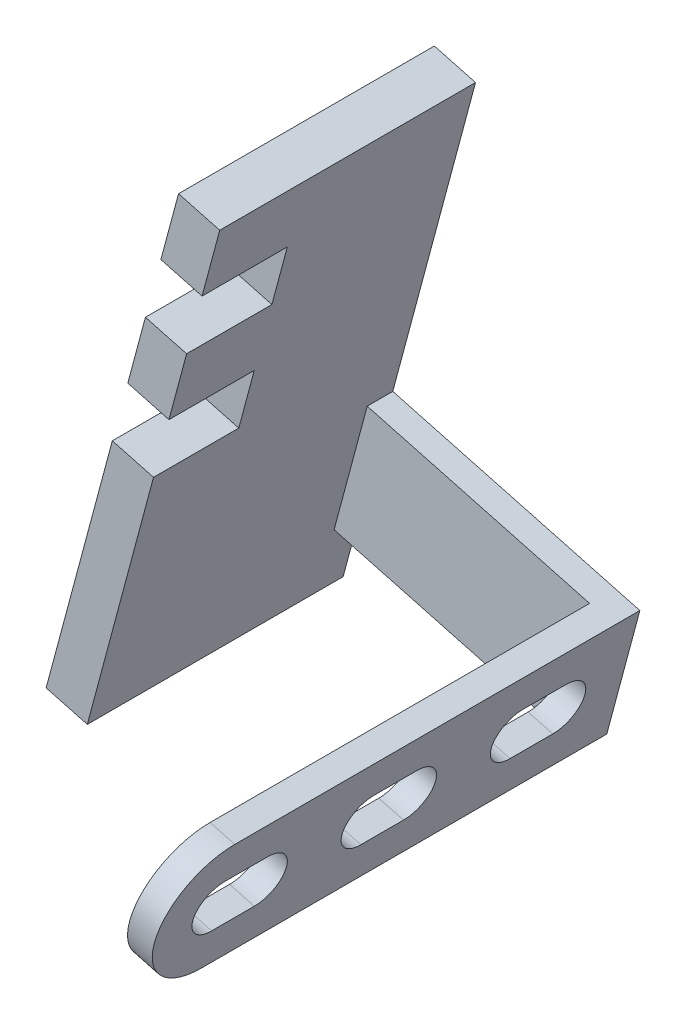
ISO-10303-21;
HEADER;
FILE_DESCRIPTION(('STEP AP214'),'2;1');
FILE_NAME('part.step','',(''),(''),'','','');
FILE_SCHEMA(('AUTOMOTIVE_DESIGN { 1 0 10303 214 1 1 1 1 }'));
ENDSEC;
DATA;
#1=APPLICATION_CONTEXT('core data for automotive mechanical design processes');
#2=APPLICATION_PROTOCOL_DEFINITION('international standard','automotive_design',2000,#1);
#3=PRODUCT_CONTEXT('',#1,'mechanical');
#4=PRODUCT('Part','Part','',(#3));
#5=PRODUCT_RELATED_PRODUCT_CATEGORY('part','',(#4));
#6=PRODUCT_DEFINITION_FORMATION('','',#4);
#7=PRODUCT_DEFINITION_CONTEXT('part definition',#1,'design');
#8=PRODUCT_DEFINITION('design','',#6,#7);
#9=PRODUCT_DEFINITION_SHAPE('','',#8);
#10=(LENGTH_UNIT() NAMED_UNIT(*) SI_UNIT(.MILLI.,.METRE.));
#11=(NAMED_UNIT(*) PLANE_ANGLE_UNIT() SI_UNIT($,.RADIAN.));
#12=(NAMED_UNIT(*) SI_UNIT($,.STERADIAN.) SOLID_ANGLE_UNIT());
#13=UNCERTAINTY_MEASURE_WITH_UNIT(LENGTH_MEASURE(1.E-05),#10,'distance_accuracy_value','');
#14=(GEOMETRIC_REPRESENTATION_CONTEXT(3) GLOBAL_UNCERTAINTY_ASSIGNED_CONTEXT((#13)) GLOBAL_UNIT_ASSIGNED_CONTEXT((#10,
#11,#12)) REPRESENTATION_CONTEXT('',''));
#15=CARTESIAN_POINT('',(0.,0.,0.));
#16=DIRECTION('',(0.,0.,1.));
#17=DIRECTION('',(1.,0.,0.));
#18=AXIS2_PLACEMENT_3D('',#15,#16,#17);
#19=CARTESIAN_POINT('',(0.,0.,30.));
#20=DIRECTION('',(-0.965925826289069,0.258819045102518,0.));
#21=DIRECTION('',(-0.258819045102518,-0.965925826289069,0.));
#22=AXIS2_PLACEMENT_3D('',#19,#20,#21);
#23=PLANE('',#22);
#24=DIRECTION('',(0.,0.,-1.));
#25=VECTOR('',#24,1.);
#26=CARTESIAN_POINT('',(3.88228567653777,14.488887394336,-30.));
#27=LINE('',#26,#25);
#28=CARTESIAN_POINT('',(3.88228567653776,14.488887394336,-24.));
#29=VERTEX_POINT('',#28);
#30=CARTESIAN_POINT('',(3.88228567653777,14.488887394336,-30.));
#31=VERTEX_POINT('',#30);
#32=EDGE_CURVE('E345',#29,#31,#27,.T.);
#33=ORIENTED_EDGE('',*,*,#32,.F.);
#34=DIRECTION('',(0.258819045102517,0.965925826289069,0.));
#35=VECTOR('',#34,1.);
#36=CARTESIAN_POINT('',(3.88228567653776,14.488887394336,-24.));
#37=LINE('',#36,#35);
#38=CARTESIAN_POINT('',(11.6468570296133,43.4666621830081,-24.));
#39=VERTEX_POINT('',#38);
#40=EDGE_CURVE('E366',#29,#39,#37,.T.);
#41=ORIENTED_EDGE('',*,*,#40,.T.);
#42=DIRECTION('',(0.,0.,-1.));
#43=VECTOR('',#42,1.);
#44=CARTESIAN_POINT('',(11.6468570296133,43.4666621830081,-30.));
#45=LINE('',#44,#43);
#46=CARTESIAN_POINT('',(11.6468570296133,43.4666621830081,-30.));
#47=VERTEX_POINT('',#46);
#48=EDGE_CURVE('E341',#39,#47,#45,.T.);
#49=ORIENTED_EDGE('',*,*,#48,.T.);
#50=DIRECTION('',(0.258819045102518,0.965925826289069,0.));
#51=VECTOR('',#50,1.);
#52=CARTESIAN_POINT('',(0.,0.,-30.));
#53=LINE('',#52,#51);
#54=CARTESIAN_POINT('',(31.0582854123021,115.911099154688,-30.));
#55=VERTEX_POINT('',#54);
#56=EDGE_CURVE('E442',#47,#55,#53,.T.);
#57=ORIENTED_EDGE('',*,*,#56,.T.);
#58=DIRECTION('',(0.,0.,-1.));
#59=VECTOR('',#58,1.);
#60=CARTESIAN_POINT('',(31.0582854123021,115.911099154688,30.));
#61=LINE('',#60,#59);
#62=CARTESIAN_POINT('',(31.0582854123021,115.911099154688,30.));
#63=VERTEX_POINT('',#62);
#64=EDGE_CURVE('E486',#63,#55,#61,.T.);
#65=ORIENTED_EDGE('',*,*,#64,.F.);
#66=DIRECTION('',(0.258819045102518,0.965925826289069,0.));
#67=VECTOR('',#66,1.);
#68=CARTESIAN_POINT('',(0.,0.,30.));
#69=LINE('',#68,#67);
#70=CARTESIAN_POINT('',(26.9171806906619,100.456285934063,30.));
#71=VERTEX_POINT('',#70);
#72=EDGE_CURVE('E449',#71,#63,#69,.T.);
#73=ORIENTED_EDGE('',*,*,#72,.F.);
#74=DIRECTION('',(0.,0.,1.));
#75=VECTOR('',#74,1.);
#76=CARTESIAN_POINT('',(26.9171806906619,100.456285934063,30.));
#77=LINE('',#76,#75);
#78=CARTESIAN_POINT('',(26.9171806906619,100.456285934063,10.));
#79=VERTEX_POINT('',#78);
#80=EDGE_CURVE('E421',#79,#71,#77,.T.);
#81=ORIENTED_EDGE('',*,*,#80,.F.);
#82=DIRECTION('',(0.258819045102518,0.965925826289069,0.));
#83=VECTOR('',#82,1.);
#84=CARTESIAN_POINT('',(26.9171806906619,100.456285934063,10.));
#85=LINE('',#84,#83);
#86=CARTESIAN_POINT('',(23.2937140592266,86.9333243660162,9.99999999999999));
#87=VERTEX_POINT('',#86);
#88=EDGE_CURVE('E417',#87,#79,#85,.T.);
#89=ORIENTED_EDGE('',*,*,#88,.F.);
#90=DIRECTION('',(0.,0.,-1.));
#91=VECTOR('',#90,1.);
#92=CARTESIAN_POINT('',(23.2937140592266,86.9333243660162,30.));
#93=LINE('',#92,#91);
#94=CARTESIAN_POINT('',(23.2937140592266,86.9333243660162,30.));
#95=VERTEX_POINT('',#94);
#96=EDGE_CURVE('E413',#95,#87,#93,.T.);
#97=ORIENTED_EDGE('',*,*,#96,.F.);
#98=CARTESIAN_POINT('',(19.1526093375863,71.4785111453911,30.));
#99=VERTEX_POINT('',#98);
#100=EDGE_CURVE('E448',#99,#95,#69,.T.);
#101=ORIENTED_EDGE('',*,*,#100,.F.);
#102=DIRECTION('',(0.,0.,1.));
#103=VECTOR('',#102,1.);
#104=CARTESIAN_POINT('',(19.1526093375863,71.4785111453911,30.));
#105=LINE('',#104,#103);
#106=CARTESIAN_POINT('',(19.1526093375863,71.4785111453911,9.99999999999999));
#107=VERTEX_POINT('',#106);
#108=EDGE_CURVE('E400',#107,#99,#105,.T.);
#109=ORIENTED_EDGE('',*,*,#108,.F.);
#110=DIRECTION('',(0.258819045102518,0.965925826289069,0.));
#111=VECTOR('',#110,1.);
#112=CARTESIAN_POINT('',(19.1526093375863,71.4785111453911,9.99999999999999));
#113=LINE('',#112,#111);
#114=CARTESIAN_POINT('',(15.5291427061511,57.9555495773442,9.99999999999999));
#115=VERTEX_POINT('',#114);
#116=EDGE_CURVE('E405',#115,#107,#113,.T.);
#117=ORIENTED_EDGE('',*,*,#116,.F.);
#118=DIRECTION('',(0.,0.,-1.));
#119=VECTOR('',#118,1.);
#120=CARTESIAN_POINT('',(15.5291427061511,57.9555495773442,30.));
#121=LINE('',#120,#119);
#122=CARTESIAN_POINT('',(15.5291427061511,57.9555495773442,30.));
#123=VERTEX_POINT('',#122);
#124=EDGE_CURVE('E409',#123,#115,#121,.T.);
#125=ORIENTED_EDGE('',*,*,#124,.F.);
#126=CARTESIAN_POINT('',(0.,0.,30.));
#127=VERTEX_POINT('',#126);
#128=EDGE_CURVE('E443',#127,#123,#69,.T.);
#129=ORIENTED_EDGE('',*,*,#128,.F.);
#130=DIRECTION('',(0.,0.,-1.));
#131=VECTOR('',#130,1.);
#132=CARTESIAN_POINT('',(0.,0.,30.));
#133=LINE('',#132,#131);
#134=CARTESIAN_POINT('',(0.,0.,-30.));
#135=VERTEX_POINT('',#134);
#136=EDGE_CURVE('E462',#127,#135,#133,.T.);
#137=ORIENTED_EDGE('',*,*,#136,.T.);
#138=EDGE_CURVE('E463',#135,#31,#53,.T.);
#139=ORIENTED_EDGE('',*,*,#138,.T.);
#140=EDGE_LOOP('',(#33,#41,#49,#57,#65,#73,#81,#89,#97,#101,#109,#117,#125,#129,#137,#139));
#141=FACE_BOUND('',#140,.T.);
#142=ADVANCED_FACE('F45',(#141),#23,.F.);
#143=CARTESIAN_POINT('',(0.,0.,30.));
#144=DIRECTION('',(0.,0.,-1.));
#145=DIRECTION('',(-1.,0.,0.));
#146=AXIS2_PLACEMENT_3D('',#143,#144,#145);
#147=PLANE('',#146);
#148=DIRECTION('',(0.258819045102518,0.965925826289069,0.));
#149=VECTOR('',#148,1.);
#150=CARTESIAN_POINT('',(-9.65925826289068,2.58819045102517,30.));
#151=LINE('',#150,#149);
#152=CARTESIAN_POINT('',(9.4933510746956,74.0667015964163,30.));
#153=VERTEX_POINT('',#152);
#154=CARTESIAN_POINT('',(13.6344557963359,89.5215148170414,30.));
#155=VERTEX_POINT('',#154);
#156=EDGE_CURVE('E459',#153,#155,#151,.T.);
#157=ORIENTED_EDGE('',*,*,#156,.F.);
#158=DIRECTION('',(0.965925826289069,-0.258819045102518,0.));
#159=VECTOR('',#158,1.);
#160=CARTESIAN_POINT('',(19.1526093375863,71.4785111453911,30.));
#161=LINE('',#160,#159);
#162=EDGE_CURVE('E502',#153,#99,#161,.T.);
#163=ORIENTED_EDGE('',*,*,#162,.T.);
#164=ORIENTED_EDGE('',*,*,#100,.T.);
#165=DIRECTION('',(-0.965925826289069,0.258819045102518,0.));
#166=VECTOR('',#165,1.);
#167=CARTESIAN_POINT('',(23.2937140592266,86.9333243660162,30.));
#168=LINE('',#167,#166);
#169=EDGE_CURVE('E490',#95,#155,#168,.T.);
#170=ORIENTED_EDGE('',*,*,#169,.T.);
#171=EDGE_LOOP('',(#157,#163,#164,#170));
#172=FACE_BOUND('',#171,.T.);
#173=ADVANCED_FACE('F571',(#172),#147,.F.);
#174=CARTESIAN_POINT('',(17.2579224277711,103.044476385088,30.));
#175=VERTEX_POINT('',#174);
#176=CARTESIAN_POINT('',(21.3990271494114,118.499289605713,30.));
#177=VERTEX_POINT('',#176);
#178=EDGE_CURVE('E453',#175,#177,#151,.T.);
#179=ORIENTED_EDGE('',*,*,#178,.F.);
#180=DIRECTION('',(0.965925826289069,-0.258819045102518,0.));
#181=VECTOR('',#180,1.);
#182=CARTESIAN_POINT('',(26.9171806906619,100.456285934063,30.));
#183=LINE('',#182,#181);
#184=EDGE_CURVE('E494',#175,#71,#183,.T.);
#185=ORIENTED_EDGE('',*,*,#184,.T.);
#186=ORIENTED_EDGE('',*,*,#72,.T.);
#187=DIRECTION('',(0.965925826289069,-0.258819045102517,0.));
#188=VECTOR('',#187,1.);
#189=CARTESIAN_POINT('',(21.3990271494114,118.499289605713,30.));
#190=LINE('',#189,#188);
#191=EDGE_CURVE('E447',#177,#63,#190,.T.);
#192=ORIENTED_EDGE('',*,*,#191,.F.);
#193=EDGE_LOOP('',(#179,#185,#186,#192));
#194=FACE_BOUND('',#193,.T.);
#195=ADVANCED_FACE('F578',(#194),#147,.F.);
#196=CARTESIAN_POINT('',(21.3990271494114,118.499289605713,30.));
#197=DIRECTION('',(0.258819045102517,0.965925826289069,0.));
#198=DIRECTION('',(-0.965925826289069,0.258819045102517,0.));
#199=AXIS2_PLACEMENT_3D('',#196,#197,#198);
#200=PLANE('',#199);
#201=DIRECTION('',(0.965925826289069,-0.258819045102517,0.));
#202=VECTOR('',#201,1.);
#203=CARTESIAN_POINT('',(21.3990271494114,118.499289605713,-30.));
#204=LINE('',#203,#202);
#205=CARTESIAN_POINT('',(21.3990271494114,118.499289605713,-30.));
#206=VERTEX_POINT('',#205);
#207=EDGE_CURVE('E466',#206,#55,#204,.T.);
#208=ORIENTED_EDGE('',*,*,#207,.F.);
#209=DIRECTION('',(0.,0.,-1.));
#210=VECTOR('',#209,1.);
#211=CARTESIAN_POINT('',(21.3990271494114,118.499289605713,30.));
#212=LINE('',#211,#210);
#213=EDGE_CURVE('E483',#177,#206,#212,.T.);
#214=ORIENTED_EDGE('',*,*,#213,.F.);
#215=ORIENTED_EDGE('',*,*,#191,.T.);
#216=ORIENTED_EDGE('',*,*,#64,.T.);
#217=EDGE_LOOP('',(#208,#214,#215,#216));
#218=FACE_BOUND('',#217,.T.);
#219=ADVANCED_FACE('F604',(#218),#200,.T.);
#220=CARTESIAN_POINT('',(-9.65925826289068,2.58819045102517,30.));
#221=DIRECTION('',(-0.965925826289069,0.258819045102518,0.));
#222=DIRECTION('',(-0.258819045102518,-0.965925826289069,0.));
#223=AXIS2_PLACEMENT_3D('',#220,#221,#222);
#224=PLANE('',#223);
#225=DIRECTION('',(0.,0.,-1.));
#226=VECTOR('',#225,1.);
#227=CARTESIAN_POINT('',(9.49335107469562,74.0667015964163,30.));
#228=LINE('',#227,#226);
#229=CARTESIAN_POINT('',(9.49335107469562,74.0667015964163,9.99999999999999));
#230=VERTEX_POINT('',#229);
#231=EDGE_CURVE('E439',#153,#230,#228,.T.);
#232=ORIENTED_EDGE('',*,*,#231,.F.);
#233=ORIENTED_EDGE('',*,*,#156,.T.);
#234=DIRECTION('',(0.,0.,1.));
#235=VECTOR('',#234,1.);
#236=CARTESIAN_POINT('',(13.6344557963359,89.5215148170414,30.));
#237=LINE('',#236,#235);
#238=CARTESIAN_POINT('',(13.6344557963359,89.5215148170414,9.99999999999999));
#239=VERTEX_POINT('',#238);
#240=EDGE_CURVE('E428',#239,#155,#237,.T.);
#241=ORIENTED_EDGE('',*,*,#240,.F.);
#242=DIRECTION('',(-0.258819045102518,-0.965925826289069,0.));
#243=VECTOR('',#242,1.);
#244=CARTESIAN_POINT('',(-9.65925826289068,2.58819045102518,9.99999999999997));
#245=LINE('',#244,#243);
#246=CARTESIAN_POINT('',(17.2579224277711,103.044476385088,10.));
#247=VERTEX_POINT('',#246);
#248=EDGE_CURVE('E506',#247,#239,#245,.T.);
#249=ORIENTED_EDGE('',*,*,#248,.F.);
#250=DIRECTION('',(0.,0.,-1.));
#251=VECTOR('',#250,1.);
#252=CARTESIAN_POINT('',(17.2579224277711,103.044476385088,30.));
#253=LINE('',#252,#251);
#254=EDGE_CURVE('E433',#175,#247,#253,.T.);
#255=ORIENTED_EDGE('',*,*,#254,.F.);
#256=ORIENTED_EDGE('',*,*,#178,.T.);
#257=ORIENTED_EDGE('',*,*,#213,.T.);
#258=DIRECTION('',(0.258819045102518,0.965925826289069,0.));
#259=VECTOR('',#258,1.);
#260=CARTESIAN_POINT('',(-9.65925826289068,2.58819045102517,-30.));
#261=LINE('',#260,#259);
#262=CARTESIAN_POINT('',(-9.65925826289068,2.58819045102517,-30.));
#263=VERTEX_POINT('',#262);
#264=EDGE_CURVE('E470',#263,#206,#261,.T.);
#265=ORIENTED_EDGE('',*,*,#264,.F.);
#266=DIRECTION('',(0.,0.,-1.));
#267=VECTOR('',#266,1.);
#268=CARTESIAN_POINT('',(-9.65925826289068,2.58819045102517,30.));
#269=LINE('',#268,#267);
#270=CARTESIAN_POINT('',(-9.65925826289068,2.58819045102517,30.));
#271=VERTEX_POINT('',#270);
#272=EDGE_CURVE('E480',#271,#263,#269,.T.);
#273=ORIENTED_EDGE('',*,*,#272,.F.);
#274=CARTESIAN_POINT('',(5.86988444326037,60.5437400283693,30.));
#275=VERTEX_POINT('',#274);
#276=EDGE_CURVE('E454',#271,#275,#151,.T.);
#277=ORIENTED_EDGE('',*,*,#276,.T.);
#278=DIRECTION('',(0.,0.,1.));
#279=VECTOR('',#278,1.);
#280=CARTESIAN_POINT('',(5.86988444326038,60.5437400283694,30.));
#281=LINE('',#280,#279);
#282=CARTESIAN_POINT('',(5.86988444326036,60.5437400283693,9.99999999999999));
#283=VERTEX_POINT('',#282);
#284=EDGE_CURVE('E436',#283,#275,#281,.T.);
#285=ORIENTED_EDGE('',*,*,#284,.F.);
#286=DIRECTION('',(-0.258819045102518,-0.965925826289069,0.));
#287=VECTOR('',#286,1.);
#288=CARTESIAN_POINT('',(-9.65925826289068,2.58819045102518,9.99999999999998));
#289=LINE('',#288,#287);
#290=EDGE_CURVE('E509',#230,#283,#289,.T.);
#291=ORIENTED_EDGE('',*,*,#290,.F.);
#292=EDGE_LOOP('',(#232,#233,#241,#249,#255,#256,#257,#265,#273,#277,#285,#291));
#293=FACE_BOUND('',#292,.T.);
#294=ADVANCED_FACE('F612',(#293),#224,.T.);
#295=CARTESIAN_POINT('',(-9.65925826289068,2.58819045102517,30.));
#296=DIRECTION('',(0.258819045102517,0.965925826289069,0.));
#297=DIRECTION('',(-0.965925826289069,0.258819045102517,0.));
#298=AXIS2_PLACEMENT_3D('',#295,#296,#297);
#299=PLANE('',#298);
#300=DIRECTION('',(0.965925826289069,-0.258819045102517,0.));
#301=VECTOR('',#300,1.);
#302=CARTESIAN_POINT('',(-9.65925826289068,2.58819045102517,-30.));
#303=LINE('',#302,#301);
#304=EDGE_CURVE('E474',#263,#135,#303,.T.);
#305=ORIENTED_EDGE('',*,*,#304,.T.);
#306=ORIENTED_EDGE('',*,*,#136,.F.);
#307=DIRECTION('',(0.965925826289069,-0.258819045102517,0.));
#308=VECTOR('',#307,1.);
#309=CARTESIAN_POINT('',(-9.65925826289068,2.58819045102517,30.));
#310=LINE('',#309,#308);
#311=EDGE_CURVE('E458',#271,#127,#310,.T.);
#312=ORIENTED_EDGE('',*,*,#311,.F.);
#313=ORIENTED_EDGE('',*,*,#272,.T.);
#314=EDGE_LOOP('',(#305,#306,#312,#313));
#315=FACE_BOUND('',#314,.T.);
#316=ADVANCED_FACE('F650',(#315),#299,.F.);
#317=ORIENTED_EDGE('',*,*,#128,.T.);
#318=DIRECTION('',(-0.965925826289069,0.258819045102518,0.));
#319=VECTOR('',#318,1.);
#320=CARTESIAN_POINT('',(15.5291427061511,57.9555495773442,30.));
#321=LINE('',#320,#319);
#322=EDGE_CURVE('E498',#123,#275,#321,.T.);
#323=ORIENTED_EDGE('',*,*,#322,.T.);
#324=ORIENTED_EDGE('',*,*,#276,.F.);
#325=ORIENTED_EDGE('',*,*,#311,.T.);
#326=EDGE_LOOP('',(#317,#323,#324,#325));
#327=FACE_BOUND('',#326,.T.);
#328=ADVANCED_FACE('F581',(#327),#147,.F.);
#329=CARTESIAN_POINT('',(0.,0.,-30.));
#330=DIRECTION('',(0.,0.,-1.));
#331=DIRECTION('',(-1.,0.,0.));
#332=AXIS2_PLACEMENT_3D('',#329,#330,#331);
#333=PLANE('',#332);
#334=ORIENTED_EDGE('',*,*,#138,.F.);
#335=ORIENTED_EDGE('',*,*,#304,.F.);
#336=ORIENTED_EDGE('',*,*,#264,.T.);
#337=ORIENTED_EDGE('',*,*,#207,.T.);
#338=ORIENTED_EDGE('',*,*,#56,.F.);
#339=DIRECTION('',(0.965925826289069,-0.258819045102517,0.));
#340=VECTOR('',#339,1.);
#341=CARTESIAN_POINT('',(69.6024066069575,27.9375194768571,-30.));
#342=LINE('',#341,#340);
#343=CARTESIAN_POINT('',(69.6024066069575,27.9375194768571,-30.));
#344=VERTEX_POINT('',#343);
#345=EDGE_CURVE('E370',#47,#344,#342,.T.);
#346=ORIENTED_EDGE('',*,*,#345,.T.);
#347=DIRECTION('',(0.258819045102517,0.965925826289069,0.));
#348=VECTOR('',#347,1.);
#349=CARTESIAN_POINT('',(61.8378352538819,-1.04025531181501,-30.));
#350=LINE('',#349,#348);
#351=CARTESIAN_POINT('',(61.8378352538819,-1.04025531181501,-30.));
#352=VERTEX_POINT('',#351);
#353=EDGE_CURVE('E392',#352,#344,#350,.T.);
#354=ORIENTED_EDGE('',*,*,#353,.F.);
#355=DIRECTION('',(0.965925826289069,-0.258819045102517,0.));
#356=VECTOR('',#355,1.);
#357=CARTESIAN_POINT('',(61.8378352538819,-1.04025531181501,-30.));
#358=LINE('',#357,#356);
#359=EDGE_CURVE('E349',#31,#352,#358,.T.);
#360=ORIENTED_EDGE('',*,*,#359,.F.);
#361=EDGE_LOOP('',(#334,#335,#336,#337,#338,#346,#354,#360));
#362=FACE_BOUND('',#361,.T.);
#363=ADVANCED_FACE('F607',(#362),#333,.T.);
#364=CARTESIAN_POINT('',(-31.0383688866823,115.985428640214,30.));
#365=DIRECTION('',(0.258819045102518,0.965925826289069,0.));
#366=DIRECTION('',(-0.965925826289069,0.258819045102518,0.));
#367=AXIS2_PLACEMENT_3D('',#364,#365,#366);
#368=PLANE('',#367);
#369=ORIENTED_EDGE('',*,*,#254,.T.);
#370=DIRECTION('',(0.965925826289069,-0.258819045102518,0.));
#371=VECTOR('',#370,1.);
#372=CARTESIAN_POINT('',(-31.0383688866823,115.985428640214,10.));
#373=LINE('',#372,#371);
#374=EDGE_CURVE('E425',#247,#79,#373,.T.);
#375=ORIENTED_EDGE('',*,*,#374,.T.);
#376=ORIENTED_EDGE('',*,*,#80,.T.);
#377=ORIENTED_EDGE('',*,*,#184,.F.);
#378=EDGE_LOOP('',(#369,#375,#376,#377));
#379=FACE_BOUND('',#378,.T.);
#380=ADVANCED_FACE('F678',(#379),#368,.F.);
#381=CARTESIAN_POINT('',(-31.0383688866823,115.985428640214,10.));
#382=DIRECTION('',(0.,0.,-1.));
#383=DIRECTION('',(0.,1.,0.));
#384=AXIS2_PLACEMENT_3D('',#381,#382,#383);
#385=PLANE('',#384);
#386=ORIENTED_EDGE('',*,*,#248,.T.);
#387=DIRECTION('',(0.965925826289069,-0.258819045102518,0.));
#388=VECTOR('',#387,1.);
#389=CARTESIAN_POINT('',(-34.6618355181175,102.462467072167,9.99999999999999));
#390=LINE('',#389,#388);
#391=EDGE_CURVE('E424',#239,#87,#390,.T.);
#392=ORIENTED_EDGE('',*,*,#391,.T.);
#393=ORIENTED_EDGE('',*,*,#88,.T.);
#394=ORIENTED_EDGE('',*,*,#374,.F.);
#395=EDGE_LOOP('',(#386,#392,#393,#394));
#396=FACE_BOUND('',#395,.T.);
#397=ADVANCED_FACE('F681',(#396),#385,.F.);
#398=CARTESIAN_POINT('',(-34.6618355181175,102.462467072167,30.));
#399=DIRECTION('',(-0.258819045102518,-0.965925826289069,0.));
#400=DIRECTION('',(0.965925826289069,-0.258819045102518,0.));
#401=AXIS2_PLACEMENT_3D('',#398,#399,#400);
#402=PLANE('',#401);
#403=ORIENTED_EDGE('',*,*,#240,.T.);
#404=ORIENTED_EDGE('',*,*,#169,.F.);
#405=ORIENTED_EDGE('',*,*,#96,.T.);
#406=ORIENTED_EDGE('',*,*,#391,.F.);
#407=EDGE_LOOP('',(#403,#404,#405,#406));
#408=FACE_BOUND('',#407,.T.);
#409=ADVANCED_FACE('F630',(#408),#402,.F.);
#410=CARTESIAN_POINT('',(-38.8029402397578,87.0076538515422,30.));
#411=DIRECTION('',(0.258819045102518,0.965925826289069,0.));
#412=DIRECTION('',(-0.965925826289069,0.258819045102518,0.));
#413=AXIS2_PLACEMENT_3D('',#410,#411,#412);
#414=PLANE('',#413);
#415=ORIENTED_EDGE('',*,*,#231,.T.);
#416=DIRECTION('',(0.965925826289069,-0.258819045102518,0.));
#417=VECTOR('',#416,1.);
#418=CARTESIAN_POINT('',(-38.8029402397578,87.0076538515422,9.99999999999999));
#419=LINE('',#418,#417);
#420=EDGE_CURVE('E396',#230,#107,#419,.T.);
#421=ORIENTED_EDGE('',*,*,#420,.T.);
#422=ORIENTED_EDGE('',*,*,#108,.T.);
#423=ORIENTED_EDGE('',*,*,#162,.F.);
#424=EDGE_LOOP('',(#415,#421,#422,#423));
#425=FACE_BOUND('',#424,.T.);
#426=ADVANCED_FACE('F639',(#425),#414,.F.);
#427=CARTESIAN_POINT('',(-38.8029402397578,87.0076538515422,9.99999999999999));
#428=DIRECTION('',(0.,0.,-1.));
#429=DIRECTION('',(0.,1.,0.));
#430=AXIS2_PLACEMENT_3D('',#427,#428,#429);
#431=PLANE('',#430);
#432=ORIENTED_EDGE('',*,*,#290,.T.);
#433=DIRECTION('',(0.965925826289069,-0.258819045102518,0.));
#434=VECTOR('',#433,1.);
#435=CARTESIAN_POINT('',(-42.4264068711931,73.4846922834952,9.99999999999999));
#436=LINE('',#435,#434);
#437=EDGE_CURVE('E397',#283,#115,#436,.T.);
#438=ORIENTED_EDGE('',*,*,#437,.T.);
#439=ORIENTED_EDGE('',*,*,#116,.T.);
#440=ORIENTED_EDGE('',*,*,#420,.F.);
#441=EDGE_LOOP('',(#432,#438,#439,#440));
#442=FACE_BOUND('',#441,.T.);
#443=ADVANCED_FACE('F641',(#442),#431,.F.);
#444=CARTESIAN_POINT('',(-42.4264068711931,73.4846922834952,30.));
#445=DIRECTION('',(-0.258819045102518,-0.965925826289069,0.));
#446=DIRECTION('',(0.965925826289069,-0.258819045102518,0.));
#447=AXIS2_PLACEMENT_3D('',#444,#445,#446);
#448=PLANE('',#447);
#449=ORIENTED_EDGE('',*,*,#284,.T.);
#450=ORIENTED_EDGE('',*,*,#322,.F.);
#451=ORIENTED_EDGE('',*,*,#124,.T.);
#452=ORIENTED_EDGE('',*,*,#437,.F.);
#453=EDGE_LOOP('',(#449,#450,#451,#452));
#454=FACE_BOUND('',#453,.T.);
#455=ADVANCED_FACE('F669',(#454),#448,.F.);
#456=CARTESIAN_POINT('',(61.8378352538819,-1.040255311815,65.));
#457=DIRECTION('',(-0.965925826289069,0.258819045102517,0.));
#458=DIRECTION('',(-0.258819045102517,-0.965925826289069,0.));
#459=AXIS2_PLACEMENT_3D('',#456,#457,#458);
#460=PLANE('',#459);
#461=DIRECTION('',(0.,0.,-1.));
#462=VECTOR('',#461,1.);
#463=CARTESIAN_POINT('',(64.1672066598046,7.65307712478664,65.));
#464=LINE('',#463,#462);
#465=CARTESIAN_POINT('',(64.1672066598046,7.65307712478664,65.));
#466=VERTEX_POINT('',#465);
#467=CARTESIAN_POINT('',(64.1672066598046,7.65307712478665,55.));
#468=VERTEX_POINT('',#467);
#469=EDGE_CURVE('E260',#466,#468,#464,.T.);
#470=ORIENTED_EDGE('',*,*,#469,.F.);
#471=CARTESIAN_POINT('',(65.7201209304197,13.448632082521,65.));
#472=DIRECTION('',(0.965925826289069,-0.258819045102517,0.));
#473=DIRECTION('',(0.258819045102517,0.965925826289069,0.));
#474=AXIS2_PLACEMENT_3D('',#471,#472,#473);
#475=CIRCLE('',#474,5.99999999999999);
#476=CARTESIAN_POINT('',(67.2730352010348,19.2441870402555,65.));
#477=VERTEX_POINT('',#476);
#478=EDGE_CURVE('E60',#477,#466,#475,.T.);
#479=ORIENTED_EDGE('',*,*,#478,.F.);
#480=DIRECTION('',(0.,0.,1.));
#481=VECTOR('',#480,1.);
#482=CARTESIAN_POINT('',(67.2730352010348,19.2441870402555,65.));
#483=LINE('',#482,#481);
#484=CARTESIAN_POINT('',(67.2730352010348,19.2441870402554,55.));
#485=VERTEX_POINT('',#484);
#486=EDGE_CURVE('E268',#485,#477,#483,.T.);
#487=ORIENTED_EDGE('',*,*,#486,.F.);
#488=CARTESIAN_POINT('',(65.7201209304197,13.448632082521,55.));
#489=DIRECTION('',(0.965925826289069,-0.258819045102517,0.));
#490=DIRECTION('',(0.258819045102517,0.965925826289069,0.));
#491=AXIS2_PLACEMENT_3D('',#488,#489,#490);
#492=CIRCLE('',#491,5.99999999999999);
#493=EDGE_CURVE('E249',#468,#485,#492,.T.);
#494=ORIENTED_EDGE('',*,*,#493,.F.);
#495=EDGE_LOOP('',(#470,#479,#487,#494));
#496=FACE_BOUND('',#495,.T.);
#497=DIRECTION('',(0.,0.,-1.));
#498=VECTOR('',#497,1.);
#499=CARTESIAN_POINT('',(64.1672066598046,7.65307712478662,30.));
#500=LINE('',#499,#498);
#501=CARTESIAN_POINT('',(64.1672066598046,7.65307712478661,30.));
#502=VERTEX_POINT('',#501);
#503=CARTESIAN_POINT('',(64.1672066598046,7.65307712478662,20.));
#504=VERTEX_POINT('',#503);
#505=EDGE_CURVE('E304',#502,#504,#500,.T.);
#506=ORIENTED_EDGE('',*,*,#505,.F.);
#507=CARTESIAN_POINT('',(65.7201209304197,13.448632082521,30.));
#508=DIRECTION('',(0.965925826289069,-0.258819045102517,0.));
#509=DIRECTION('',(0.258819045102517,0.965925826289069,0.));
#510=AXIS2_PLACEMENT_3D('',#507,#508,#509);
#511=CIRCLE('',#510,6.00000000000001);
#512=CARTESIAN_POINT('',(67.2730352010348,19.2441870402555,30.));
#513=VERTEX_POINT('',#512);
#514=EDGE_CURVE('E68',#513,#502,#511,.T.);
#515=ORIENTED_EDGE('',*,*,#514,.F.);
#516=DIRECTION('',(0.,0.,1.));
#517=VECTOR('',#516,1.);
#518=CARTESIAN_POINT('',(67.2730352010348,19.2441870402555,30.));
#519=LINE('',#518,#517);
#520=CARTESIAN_POINT('',(67.2730352010348,19.2441870402554,20.));
#521=VERTEX_POINT('',#520);
#522=EDGE_CURVE('E286',#521,#513,#519,.T.);
#523=ORIENTED_EDGE('',*,*,#522,.F.);
#524=CARTESIAN_POINT('',(65.7201209304197,13.448632082521,20.));
#525=DIRECTION('',(0.965925826289069,-0.258819045102517,0.));
#526=DIRECTION('',(0.258819045102517,0.965925826289069,0.));
#527=AXIS2_PLACEMENT_3D('',#524,#525,#526);
#528=CIRCLE('',#527,5.99999999999999);
#529=EDGE_CURVE('E300',#504,#521,#528,.T.);
#530=ORIENTED_EDGE('',*,*,#529,.F.);
#531=EDGE_LOOP('',(#506,#515,#523,#530));
#532=FACE_BOUND('',#531,.T.);
#533=DIRECTION('',(0.,0.,-1.));
#534=VECTOR('',#533,1.);
#535=CARTESIAN_POINT('',(64.1672066598046,7.65307712478662,-4.99999999999997));
#536=LINE('',#535,#534);
#537=CARTESIAN_POINT('',(64.1672066598046,7.65307712478662,-4.99999999999998));
#538=VERTEX_POINT('',#537);
#539=CARTESIAN_POINT('',(64.1672066598046,7.6530771247866,-15.));
#540=VERTEX_POINT('',#539);
#541=EDGE_CURVE('E331',#538,#540,#536,.T.);
#542=ORIENTED_EDGE('',*,*,#541,.F.);
#543=CARTESIAN_POINT('',(65.7201209304197,13.448632082521,-4.99999999999997));
#544=DIRECTION('',(0.965925826289069,-0.258819045102517,0.));
#545=DIRECTION('',(0.258819045102517,0.965925826289069,0.));
#546=AXIS2_PLACEMENT_3D('',#543,#544,#545);
#547=CIRCLE('',#546,6.);
#548=CARTESIAN_POINT('',(67.2730352010348,19.2441870402554,-4.99999999999997));
#549=VERTEX_POINT('',#548);
#550=EDGE_CURVE('E296',#549,#538,#547,.T.);
#551=ORIENTED_EDGE('',*,*,#550,.F.);
#552=DIRECTION('',(0.,0.,1.));
#553=VECTOR('',#552,1.);
#554=CARTESIAN_POINT('',(67.2730352010348,19.2441870402554,-4.99999999999997));
#555=LINE('',#554,#553);
#556=CARTESIAN_POINT('',(67.2730352010348,19.2441870402555,-15.));
#557=VERTEX_POINT('',#556);
#558=EDGE_CURVE('E314',#557,#549,#555,.T.);
#559=ORIENTED_EDGE('',*,*,#558,.F.);
#560=CARTESIAN_POINT('',(65.7201209304197,13.448632082521,-15.));
#561=DIRECTION('',(0.965925826289069,-0.258819045102517,0.));
#562=DIRECTION('',(0.258819045102517,0.965925826289069,0.));
#563=AXIS2_PLACEMENT_3D('',#560,#561,#562);
#564=CIRCLE('',#563,6.00000000000001);
#565=EDGE_CURVE('E327',#540,#557,#564,.T.);
#566=ORIENTED_EDGE('',*,*,#565,.F.);
#567=EDGE_LOOP('',(#542,#551,#559,#566));
#568=FACE_BOUND('',#567,.T.);
#569=DIRECTION('',(0.,0.,1.));
#570=VECTOR('',#569,1.);
#571=CARTESIAN_POINT('',(69.6024066069574,27.9375194768571,65.));
#572=LINE('',#571,#570);
#573=CARTESIAN_POINT('',(69.6024066069574,27.9375194768571,65.));
#574=VERTEX_POINT('',#573);
#575=EDGE_CURVE('E373',#344,#574,#572,.T.);
#576=ORIENTED_EDGE('',*,*,#575,.T.);
#577=CARTESIAN_POINT('',(65.7201209304197,13.448632082521,65.));
#578=DIRECTION('',(0.965925826289069,-0.258819045102517,0.));
#579=DIRECTION('',(0.258819045102517,0.965925826289069,0.));
#580=AXIS2_PLACEMENT_3D('',#577,#578,#579);
#581=CIRCLE('',#580,15.);
#582=CARTESIAN_POINT('',(61.8378352538819,-1.040255311815,65.));
#583=VERTEX_POINT('',#582);
#584=EDGE_CURVE('E278',#574,#583,#581,.T.);
#585=ORIENTED_EDGE('',*,*,#584,.T.);
#586=DIRECTION('',(0.,0.,1.));
#587=VECTOR('',#586,1.);
#588=CARTESIAN_POINT('',(61.8378352538819,-1.040255311815,65.));
#589=LINE('',#588,#587);
#590=EDGE_CURVE('E353',#352,#583,#589,.T.);
#591=ORIENTED_EDGE('',*,*,#590,.F.);
#592=ORIENTED_EDGE('',*,*,#353,.T.);
#593=EDGE_LOOP('',(#576,#585,#591,#592));
#594=FACE_BOUND('',#593,.T.);
#595=ADVANCED_FACE('F265',(#496,#532,#568,#594),#460,.F.);
#596=CARTESIAN_POINT('',(56.0422802961475,0.512658958800091,-24.));
#597=DIRECTION('',(0.965925826289069,-0.258819045102517,0.));
#598=DIRECTION('',(0.258819045102517,0.965925826289069,0.));
#599=AXIS2_PLACEMENT_3D('',#596,#597,#598);
#600=PLANE('',#599);
#601=DIRECTION('',(0.,0.,1.));
#602=VECTOR('',#601,1.);
#603=CARTESIAN_POINT('',(61.4774802433004,20.7971013108705,-24.));
#604=LINE('',#603,#602);
#605=CARTESIAN_POINT('',(61.4774802433004,20.7971013108705,55.));
#606=VERTEX_POINT('',#605);
#607=CARTESIAN_POINT('',(61.4774802433004,20.7971013108705,65.));
#608=VERTEX_POINT('',#607);
#609=EDGE_CURVE('E53',#606,#608,#604,.T.);
#610=ORIENTED_EDGE('',*,*,#609,.T.);
#611=CARTESIAN_POINT('',(59.9245659726853,15.0015463531361,65.));
#612=DIRECTION('',(0.965925826289069,-0.258819045102517,0.));
#613=DIRECTION('',(0.258819045102517,0.965925826289069,0.));
#614=AXIS2_PLACEMENT_3D('',#611,#612,#613);
#615=CIRCLE('',#614,5.99999999999999);
#616=CARTESIAN_POINT('',(58.3716517020702,9.20599139540173,65.));
#617=VERTEX_POINT('',#616);
#618=EDGE_CURVE('E11',#608,#617,#615,.T.);
#619=ORIENTED_EDGE('',*,*,#618,.T.);
#620=DIRECTION('',(0.,0.,-1.));
#621=VECTOR('',#620,1.);
#622=CARTESIAN_POINT('',(58.3716517020702,9.20599139540179,-24.));
#623=LINE('',#622,#621);
#624=CARTESIAN_POINT('',(58.3716517020702,9.20599139540174,55.));
#625=VERTEX_POINT('',#624);
#626=EDGE_CURVE('E544',#617,#625,#623,.T.);
#627=ORIENTED_EDGE('',*,*,#626,.T.);
#628=CARTESIAN_POINT('',(59.9245659726853,15.0015463531361,55.));
#629=DIRECTION('',(0.965925826289069,-0.258819045102517,0.));
#630=DIRECTION('',(0.258819045102517,0.965925826289069,0.));
#631=AXIS2_PLACEMENT_3D('',#628,#629,#630);
#632=CIRCLE('',#631,5.99999999999999);
#633=EDGE_CURVE('E252',#625,#606,#632,.T.);
#634=ORIENTED_EDGE('',*,*,#633,.T.);
#635=EDGE_LOOP('',(#610,#619,#627,#634));
#636=FACE_BOUND('',#635,.T.);
#637=DIRECTION('',(0.,0.,1.));
#638=VECTOR('',#637,1.);
#639=CARTESIAN_POINT('',(61.4774802433004,20.7971013108705,-24.));
#640=LINE('',#639,#638);
#641=CARTESIAN_POINT('',(61.4774802433004,20.7971013108705,20.));
#642=VERTEX_POINT('',#641);
#643=CARTESIAN_POINT('',(61.4774802433004,20.7971013108706,30.));
#644=VERTEX_POINT('',#643);
#645=EDGE_CURVE('E536',#642,#644,#640,.T.);
#646=ORIENTED_EDGE('',*,*,#645,.T.);
#647=CARTESIAN_POINT('',(59.9245659726853,15.0015463531361,30.));
#648=DIRECTION('',(0.965925826289069,-0.258819045102517,0.));
#649=DIRECTION('',(0.258819045102517,0.965925826289069,0.));
#650=AXIS2_PLACEMENT_3D('',#647,#648,#649);
#651=CIRCLE('',#650,6.00000000000001);
#652=CARTESIAN_POINT('',(58.3716517020702,9.20599139540171,30.));
#653=VERTEX_POINT('',#652);
#654=EDGE_CURVE('E540',#644,#653,#651,.T.);
#655=ORIENTED_EDGE('',*,*,#654,.T.);
#656=DIRECTION('',(0.,0.,-1.));
#657=VECTOR('',#656,1.);
#658=CARTESIAN_POINT('',(58.3716517020702,9.20599139540178,-24.));
#659=LINE('',#658,#657);
#660=CARTESIAN_POINT('',(58.3716517020702,9.20599139540172,20.));
#661=VERTEX_POINT('',#660);
#662=EDGE_CURVE('E528',#653,#661,#659,.T.);
#663=ORIENTED_EDGE('',*,*,#662,.T.);
#664=CARTESIAN_POINT('',(59.9245659726853,15.0015463531361,20.));
#665=DIRECTION('',(0.965925826289069,-0.258819045102517,0.));
#666=DIRECTION('',(0.258819045102517,0.965925826289069,0.));
#667=AXIS2_PLACEMENT_3D('',#664,#665,#666);
#668=CIRCLE('',#667,5.99999999999999);
#669=EDGE_CURVE('E532',#661,#642,#668,.T.);
#670=ORIENTED_EDGE('',*,*,#669,.T.);
#671=EDGE_LOOP('',(#646,#655,#663,#670));
#672=FACE_BOUND('',#671,.T.);
#673=DIRECTION('',(0.,0.,1.));
#674=VECTOR('',#673,1.);
#675=CARTESIAN_POINT('',(61.4774802433004,20.7971013108706,-24.));
#676=LINE('',#675,#674);
#677=CARTESIAN_POINT('',(61.4774802433004,20.7971013108706,-15.));
#678=VERTEX_POINT('',#677);
#679=CARTESIAN_POINT('',(61.4774802433004,20.7971013108705,-4.99999999999997));
#680=VERTEX_POINT('',#679);
#681=EDGE_CURVE('E520',#678,#680,#676,.T.);
#682=ORIENTED_EDGE('',*,*,#681,.T.);
#683=CARTESIAN_POINT('',(59.9245659726853,15.0015463531361,-4.99999999999997));
#684=DIRECTION('',(0.965925826289069,-0.258819045102517,0.));
#685=DIRECTION('',(0.258819045102517,0.965925826289069,0.));
#686=AXIS2_PLACEMENT_3D('',#683,#684,#685);
#687=CIRCLE('',#686,6.);
#688=CARTESIAN_POINT('',(58.3716517020702,9.20599139540172,-4.99999999999997));
#689=VERTEX_POINT('',#688);
#690=EDGE_CURVE('E524',#680,#689,#687,.T.);
#691=ORIENTED_EDGE('',*,*,#690,.T.);
#692=DIRECTION('',(0.,0.,-1.));
#693=VECTOR('',#692,1.);
#694=CARTESIAN_POINT('',(58.3716517020702,9.20599139540171,-24.));
#695=LINE('',#694,#693);
#696=CARTESIAN_POINT('',(58.3716517020702,9.20599139540171,-15.));
#697=VERTEX_POINT('',#696);
#698=EDGE_CURVE('E512',#689,#697,#695,.T.);
#699=ORIENTED_EDGE('',*,*,#698,.T.);
#700=CARTESIAN_POINT('',(59.9245659726853,15.0015463531361,-15.));
#701=DIRECTION('',(0.965925826289069,-0.258819045102517,0.));
#702=DIRECTION('',(0.258819045102517,0.965925826289069,0.));
#703=AXIS2_PLACEMENT_3D('',#700,#701,#702);
#704=CIRCLE('',#703,6.00000000000001);
#705=EDGE_CURVE('E516',#697,#678,#704,.T.);
#706=ORIENTED_EDGE('',*,*,#705,.T.);
#707=EDGE_LOOP('',(#682,#691,#699,#706));
#708=FACE_BOUND('',#707,.T.);
#709=DIRECTION('',(0.,0.,-1.));
#710=VECTOR('',#709,1.);
#711=CARTESIAN_POINT('',(63.8068516492231,29.4904337474722,-24.));
#712=LINE('',#711,#710);
#713=CARTESIAN_POINT('',(63.806851649223,29.4904337474722,65.));
#714=VERTEX_POINT('',#713);
#715=CARTESIAN_POINT('',(63.8068516492231,29.4904337474722,-24.));
#716=VERTEX_POINT('',#715);
#717=EDGE_CURVE('E380',#714,#716,#712,.T.);
#718=ORIENTED_EDGE('',*,*,#717,.T.);
#719=DIRECTION('',(0.258819045102517,0.965925826289069,0.));
#720=VECTOR('',#719,1.);
#721=CARTESIAN_POINT('',(56.0422802961475,0.512658958800091,-24.));
#722=LINE('',#721,#720);
#723=CARTESIAN_POINT('',(56.0422802961475,0.512658958800091,-24.));
#724=VERTEX_POINT('',#723);
#725=EDGE_CURVE('E388',#724,#716,#722,.T.);
#726=ORIENTED_EDGE('',*,*,#725,.F.);
#727=DIRECTION('',(0.,0.,-1.));
#728=VECTOR('',#727,1.);
#729=CARTESIAN_POINT('',(56.0422802961475,0.512658958800091,-24.));
#730=LINE('',#729,#728);
#731=CARTESIAN_POINT('',(56.0422802961475,0.512658958800094,65.));
#732=VERTEX_POINT('',#731);
#733=EDGE_CURVE('E359',#732,#724,#730,.T.);
#734=ORIENTED_EDGE('',*,*,#733,.F.);
#735=CARTESIAN_POINT('',(59.9245659726853,15.0015463531361,65.));
#736=DIRECTION('',(0.965925826289069,-0.258819045102517,0.));
#737=DIRECTION('',(0.258819045102517,0.965925826289069,0.));
#738=AXIS2_PLACEMENT_3D('',#735,#736,#737);
#739=CIRCLE('',#738,15.);
#740=EDGE_CURVE('E337',#732,#714,#739,.F.);
#741=ORIENTED_EDGE('',*,*,#740,.T.);
#742=EDGE_LOOP('',(#718,#726,#734,#741));
#743=FACE_BOUND('',#742,.T.);
#744=ADVANCED_FACE('F551',(#636,#672,#708,#743),#600,.F.);
#745=CARTESIAN_POINT('',(3.88228567653776,14.488887394336,-24.));
#746=DIRECTION('',(0.,0.,-1.));
#747=DIRECTION('',(-1.,0.,0.));
#748=AXIS2_PLACEMENT_3D('',#745,#746,#747);
#749=PLANE('',#748);
#750=DIRECTION('',(-0.965925826289069,0.258819045102517,0.));
#751=VECTOR('',#750,1.);
#752=CARTESIAN_POINT('',(11.6468570296133,43.4666621830081,-24.));
#753=LINE('',#752,#751);
#754=EDGE_CURVE('E350',#716,#39,#753,.T.);
#755=ORIENTED_EDGE('',*,*,#754,.T.);
#756=ORIENTED_EDGE('',*,*,#40,.F.);
#757=DIRECTION('',(-0.965925826289069,0.258819045102517,0.));
#758=VECTOR('',#757,1.);
#759=CARTESIAN_POINT('',(3.88228567653776,14.488887394336,-24.));
#760=LINE('',#759,#758);
#761=EDGE_CURVE('E362',#724,#29,#760,.T.);
#762=ORIENTED_EDGE('',*,*,#761,.F.);
#763=ORIENTED_EDGE('',*,*,#725,.T.);
#764=EDGE_LOOP('',(#755,#756,#762,#763));
#765=FACE_BOUND('',#764,.T.);
#766=ADVANCED_FACE('F591',(#765),#749,.F.);
#767=CARTESIAN_POINT('',(3.88228567653776,14.488887394336,0.));
#768=DIRECTION('',(0.258819045102517,0.965925826289069,0.));
#769=DIRECTION('',(-0.965925826289069,0.258819045102517,0.));
#770=AXIS2_PLACEMENT_3D('',#767,#768,#769);
#771=PLANE('',#770);
#772=ORIENTED_EDGE('',*,*,#32,.T.);
#773=ORIENTED_EDGE('',*,*,#359,.T.);
#774=ORIENTED_EDGE('',*,*,#590,.T.);
#775=DIRECTION('',(-0.965925826289069,0.258819045102517,0.));
#776=VECTOR('',#775,1.);
#777=CARTESIAN_POINT('',(56.0422802961475,0.512658958800094,65.));
#778=LINE('',#777,#776);
#779=EDGE_CURVE('E356',#583,#732,#778,.T.);
#780=ORIENTED_EDGE('',*,*,#779,.T.);
#781=ORIENTED_EDGE('',*,*,#733,.T.);
#782=ORIENTED_EDGE('',*,*,#761,.T.);
#783=EDGE_LOOP('',(#772,#773,#774,#780,#781,#782));
#784=FACE_BOUND('',#783,.T.);
#785=ADVANCED_FACE('F587',(#784),#771,.F.);
#786=CARTESIAN_POINT('',(11.6468570296133,43.4666621830081,0.));
#787=DIRECTION('',(0.258819045102517,0.965925826289069,0.));
#788=DIRECTION('',(-0.965925826289069,0.258819045102517,0.));
#789=AXIS2_PLACEMENT_3D('',#786,#787,#788);
#790=PLANE('',#789);
#791=ORIENTED_EDGE('',*,*,#48,.F.);
#792=ORIENTED_EDGE('',*,*,#754,.F.);
#793=ORIENTED_EDGE('',*,*,#717,.F.);
#794=DIRECTION('',(-0.965925826289069,0.258819045102517,0.));
#795=VECTOR('',#794,1.);
#796=CARTESIAN_POINT('',(63.806851649223,29.4904337474722,65.));
#797=LINE('',#796,#795);
#798=EDGE_CURVE('E376',#574,#714,#797,.T.);
#799=ORIENTED_EDGE('',*,*,#798,.F.);
#800=ORIENTED_EDGE('',*,*,#575,.F.);
#801=ORIENTED_EDGE('',*,*,#345,.F.);
#802=EDGE_LOOP('',(#791,#792,#793,#799,#800,#801));
#803=FACE_BOUND('',#802,.T.);
#804=ADVANCED_FACE('F596',(#803),#790,.T.);
#805=CARTESIAN_POINT('',(27.5264288406101,23.6826010339483,65.));
#806=DIRECTION('',(0.965925826289069,-0.258819045102517,0.));
#807=DIRECTION('',(0.258819045102517,0.965925826289069,0.));
#808=AXIS2_PLACEMENT_3D('',#805,#806,#807);
#809=CYLINDRICAL_SURFACE('',#808,15.);
#810=ORIENTED_EDGE('',*,*,#740,.F.);
#811=ORIENTED_EDGE('',*,*,#779,.F.);
#812=ORIENTED_EDGE('',*,*,#584,.F.);
#813=ORIENTED_EDGE('',*,*,#798,.T.);
#814=EDGE_LOOP('',(#810,#811,#812,#813));
#815=FACE_BOUND('',#814,.T.);
#816=ADVANCED_FACE('F658',(#815),#809,.T.);
#817=CARTESIAN_POINT('',(36.7423461417476,21.2132034355966,-4.99999999999999));
#818=DIRECTION('',(0.965925826289069,-0.258819045102517,0.));
#819=DIRECTION('',(0.258819045102517,0.965925826289069,0.));
#820=AXIS2_PLACEMENT_3D('',#817,#818,#819);
#821=CYLINDRICAL_SURFACE('',#820,6.);
#822=DIRECTION('',(0.965925826289069,-0.258819045102517,0.));
#823=VECTOR('',#822,1.);
#824=CARTESIAN_POINT('',(38.2952604123627,27.008758393331,-4.99999999999999));
#825=LINE('',#824,#823);
#826=EDGE_CURVE('E321',#680,#549,#825,.T.);
#827=ORIENTED_EDGE('',*,*,#826,.T.);
#828=ORIENTED_EDGE('',*,*,#550,.T.);
#829=DIRECTION('',(0.965925826289069,-0.258819045102517,0.));
#830=VECTOR('',#829,1.);
#831=CARTESIAN_POINT('',(35.1894318711325,15.4176484778621,-4.99999999999999));
#832=LINE('',#831,#830);
#833=EDGE_CURVE('E310',#689,#538,#832,.T.);
#834=ORIENTED_EDGE('',*,*,#833,.F.);
#835=ORIENTED_EDGE('',*,*,#690,.F.);
#836=EDGE_LOOP('',(#827,#828,#834,#835));
#837=FACE_BOUND('',#836,.T.);
#838=ADVANCED_FACE('F798',(#837),#821,.F.);
#839=CARTESIAN_POINT('',(38.2952604123627,27.008758393331,-4.99999999999999));
#840=DIRECTION('',(0.258819045102517,0.965925826289069,0.));
#841=DIRECTION('',(-0.965925826289069,0.258819045102517,0.));
#842=AXIS2_PLACEMENT_3D('',#839,#840,#841);
#843=PLANE('',#842);
#844=DIRECTION('',(0.965925826289069,-0.258819045102517,0.));
#845=VECTOR('',#844,1.);
#846=CARTESIAN_POINT('',(38.2952604123627,27.008758393331,-15.));
#847=LINE('',#846,#845);
#848=EDGE_CURVE('E318',#678,#557,#847,.T.);
#849=ORIENTED_EDGE('',*,*,#848,.T.);
#850=ORIENTED_EDGE('',*,*,#558,.T.);
#851=ORIENTED_EDGE('',*,*,#826,.F.);
#852=ORIENTED_EDGE('',*,*,#681,.F.);
#853=EDGE_LOOP('',(#849,#850,#851,#852));
#854=FACE_BOUND('',#853,.T.);
#855=ADVANCED_FACE('F809',(#854),#843,.F.);
#856=CARTESIAN_POINT('',(36.7423461417476,21.2132034355966,-15.));
#857=DIRECTION('',(0.965925826289069,-0.258819045102517,0.));
#858=DIRECTION('',(0.258819045102517,0.965925826289069,0.));
#859=AXIS2_PLACEMENT_3D('',#856,#857,#858);
#860=CYLINDRICAL_SURFACE('',#859,6.00000000000001);
#861=DIRECTION('',(0.965925826289069,-0.258819045102517,0.));
#862=VECTOR('',#861,1.);
#863=CARTESIAN_POINT('',(35.1894318711325,15.4176484778621,-15.));
#864=LINE('',#863,#862);
#865=EDGE_CURVE('E315',#697,#540,#864,.T.);
#866=ORIENTED_EDGE('',*,*,#865,.T.);
#867=ORIENTED_EDGE('',*,*,#565,.T.);
#868=ORIENTED_EDGE('',*,*,#848,.F.);
#869=ORIENTED_EDGE('',*,*,#705,.F.);
#870=EDGE_LOOP('',(#866,#867,#868,#869));
#871=FACE_BOUND('',#870,.T.);
#872=ADVANCED_FACE('F819',(#871),#860,.F.);
#873=CARTESIAN_POINT('',(35.1894318711325,15.4176484778621,-4.99999999999999));
#874=DIRECTION('',(-0.258819045102517,-0.965925826289069,0.));
#875=DIRECTION('',(0.965925826289069,-0.258819045102517,0.));
#876=AXIS2_PLACEMENT_3D('',#873,#874,#875);
#877=PLANE('',#876);
#878=ORIENTED_EDGE('',*,*,#833,.T.);
#879=ORIENTED_EDGE('',*,*,#541,.T.);
#880=ORIENTED_EDGE('',*,*,#865,.F.);
#881=ORIENTED_EDGE('',*,*,#698,.F.);
#882=EDGE_LOOP('',(#878,#879,#880,#881));
#883=FACE_BOUND('',#882,.T.);
#884=ADVANCED_FACE('F829',(#883),#877,.F.);
#885=CARTESIAN_POINT('',(36.7423461417476,21.2132034355966,30.));
#886=DIRECTION('',(0.965925826289069,-0.258819045102517,0.));
#887=DIRECTION('',(0.258819045102517,0.965925826289069,0.));
#888=AXIS2_PLACEMENT_3D('',#885,#886,#887);
#889=CYLINDRICAL_SURFACE('',#888,6.00000000000001);
#890=DIRECTION('',(0.965925826289069,-0.258819045102517,0.));
#891=VECTOR('',#890,1.);
#892=CARTESIAN_POINT('',(38.2952604123627,27.008758393331,30.));
#893=LINE('',#892,#891);
#894=EDGE_CURVE('E293',#644,#513,#893,.T.);
#895=ORIENTED_EDGE('',*,*,#894,.T.);
#896=ORIENTED_EDGE('',*,*,#514,.T.);
#897=DIRECTION('',(0.965925826289069,-0.258819045102517,0.));
#898=VECTOR('',#897,1.);
#899=CARTESIAN_POINT('',(35.1894318711325,15.4176484778621,30.));
#900=LINE('',#899,#898);
#901=EDGE_CURVE('E283',#653,#502,#900,.T.);
#902=ORIENTED_EDGE('',*,*,#901,.F.);
#903=ORIENTED_EDGE('',*,*,#654,.F.);
#904=EDGE_LOOP('',(#895,#896,#902,#903));
#905=FACE_BOUND('',#904,.T.);
#906=ADVANCED_FACE('F839',(#905),#889,.F.);
#907=CARTESIAN_POINT('',(38.2952604123627,27.008758393331,30.));
#908=DIRECTION('',(0.258819045102517,0.965925826289069,0.));
#909=DIRECTION('',(-0.965925826289069,0.258819045102517,0.));
#910=AXIS2_PLACEMENT_3D('',#907,#908,#909);
#911=PLANE('',#910);
#912=DIRECTION('',(0.965925826289069,-0.258819045102517,0.));
#913=VECTOR('',#912,1.);
#914=CARTESIAN_POINT('',(38.2952604123627,27.008758393331,20.));
#915=LINE('',#914,#913);
#916=EDGE_CURVE('E290',#642,#521,#915,.T.);
#917=ORIENTED_EDGE('',*,*,#916,.T.);
#918=ORIENTED_EDGE('',*,*,#522,.T.);
#919=ORIENTED_EDGE('',*,*,#894,.F.);
#920=ORIENTED_EDGE('',*,*,#645,.F.);
#921=EDGE_LOOP('',(#917,#918,#919,#920));
#922=FACE_BOUND('',#921,.T.);
#923=ADVANCED_FACE('F849',(#922),#911,.F.);
#924=CARTESIAN_POINT('',(36.7423461417476,21.2132034355966,20.));
#925=DIRECTION('',(0.965925826289069,-0.258819045102517,0.));
#926=DIRECTION('',(0.258819045102517,0.965925826289069,0.));
#927=AXIS2_PLACEMENT_3D('',#924,#925,#926);
#928=CYLINDRICAL_SURFACE('',#927,5.99999999999999);
#929=DIRECTION('',(0.965925826289069,-0.258819045102517,0.));
#930=VECTOR('',#929,1.);
#931=CARTESIAN_POINT('',(35.1894318711325,15.4176484778621,20.));
#932=LINE('',#931,#930);
#933=EDGE_CURVE('E287',#661,#504,#932,.T.);
#934=ORIENTED_EDGE('',*,*,#933,.T.);
#935=ORIENTED_EDGE('',*,*,#529,.T.);
#936=ORIENTED_EDGE('',*,*,#916,.F.);
#937=ORIENTED_EDGE('',*,*,#669,.F.);
#938=EDGE_LOOP('',(#934,#935,#936,#937));
#939=FACE_BOUND('',#938,.T.);
#940=ADVANCED_FACE('F565',(#939),#928,.F.);
#941=CARTESIAN_POINT('',(35.1894318711325,15.4176484778621,30.));
#942=DIRECTION('',(-0.258819045102517,-0.965925826289069,0.));
#943=DIRECTION('',(0.965925826289069,-0.258819045102517,0.));
#944=AXIS2_PLACEMENT_3D('',#941,#942,#943);
#945=PLANE('',#944);
#946=ORIENTED_EDGE('',*,*,#901,.T.);
#947=ORIENTED_EDGE('',*,*,#505,.T.);
#948=ORIENTED_EDGE('',*,*,#933,.F.);
#949=ORIENTED_EDGE('',*,*,#662,.F.);
#950=EDGE_LOOP('',(#946,#947,#948,#949));
#951=FACE_BOUND('',#950,.T.);
#952=ADVANCED_FACE('F558',(#951),#945,.F.);
#953=CARTESIAN_POINT('',(36.7423461417476,21.2132034355966,65.));
#954=DIRECTION('',(0.965925826289069,-0.258819045102517,0.));
#955=DIRECTION('',(0.258819045102517,0.965925826289069,0.));
#956=AXIS2_PLACEMENT_3D('',#953,#954,#955);
#957=CYLINDRICAL_SURFACE('',#956,5.99999999999999);
#958=DIRECTION('',(0.965925826289069,-0.258819045102517,0.));
#959=VECTOR('',#958,1.);
#960=CARTESIAN_POINT('',(38.2952604123627,27.008758393331,65.));
#961=LINE('',#960,#959);
#962=EDGE_CURVE('E275',#608,#477,#961,.T.);
#963=ORIENTED_EDGE('',*,*,#962,.T.);
#964=ORIENTED_EDGE('',*,*,#478,.T.);
#965=DIRECTION('',(0.965925826289069,-0.258819045102517,0.));
#966=VECTOR('',#965,1.);
#967=CARTESIAN_POINT('',(35.1894318711325,15.4176484778622,65.));
#968=LINE('',#967,#966);
#969=EDGE_CURVE('E257',#617,#466,#968,.T.);
#970=ORIENTED_EDGE('',*,*,#969,.F.);
#971=ORIENTED_EDGE('',*,*,#618,.F.);
#972=EDGE_LOOP('',(#963,#964,#970,#971));
#973=FACE_BOUND('',#972,.T.);
#974=ADVANCED_FACE('F556',(#973),#957,.F.);
#975=CARTESIAN_POINT('',(38.2952604123627,27.008758393331,65.));
#976=DIRECTION('',(0.258819045102517,0.965925826289069,0.));
#977=DIRECTION('',(-0.965925826289069,0.258819045102517,0.));
#978=AXIS2_PLACEMENT_3D('',#975,#976,#977);
#979=PLANE('',#978);
#980=DIRECTION('',(0.965925826289069,-0.258819045102517,0.));
#981=VECTOR('',#980,1.);
#982=CARTESIAN_POINT('',(38.2952604123627,27.008758393331,55.));
#983=LINE('',#982,#981);
#984=EDGE_CURVE('E256',#606,#485,#983,.T.);
#985=ORIENTED_EDGE('',*,*,#984,.T.);
#986=ORIENTED_EDGE('',*,*,#486,.T.);
#987=ORIENTED_EDGE('',*,*,#962,.F.);
#988=ORIENTED_EDGE('',*,*,#609,.F.);
#989=EDGE_LOOP('',(#985,#986,#987,#988));
#990=FACE_BOUND('',#989,.T.);
#991=ADVANCED_FACE('F555',(#990),#979,.F.);
#992=CARTESIAN_POINT('',(36.7423461417476,21.2132034355966,55.));
#993=DIRECTION('',(0.965925826289069,-0.258819045102517,0.));
#994=DIRECTION('',(0.258819045102517,0.965925826289069,0.));
#995=AXIS2_PLACEMENT_3D('',#992,#993,#994);
#996=CYLINDRICAL_SURFACE('',#995,5.99999999999999);
#997=DIRECTION('',(0.965925826289069,-0.258819045102517,0.));
#998=VECTOR('',#997,1.);
#999=CARTESIAN_POINT('',(35.1894318711325,15.4176484778622,55.));
#1000=LINE('',#999,#998);
#1001=EDGE_CURVE('E244',#625,#468,#1000,.T.);
#1002=ORIENTED_EDGE('',*,*,#1001,.T.);
#1003=ORIENTED_EDGE('',*,*,#493,.T.);
#1004=ORIENTED_EDGE('',*,*,#984,.F.);
#1005=ORIENTED_EDGE('',*,*,#633,.F.);
#1006=EDGE_LOOP('',(#1002,#1003,#1004,#1005));
#1007=FACE_BOUND('',#1006,.T.);
#1008=ADVANCED_FACE('F246',(#1007),#996,.F.);
#1009=CARTESIAN_POINT('',(35.1894318711325,15.4176484778622,65.));
#1010=DIRECTION('',(-0.258819045102517,-0.965925826289069,0.));
#1011=DIRECTION('',(0.965925826289069,-0.258819045102517,0.));
#1012=AXIS2_PLACEMENT_3D('',#1009,#1010,#1011);
#1013=PLANE('',#1012);
#1014=ORIENTED_EDGE('',*,*,#969,.T.);
#1015=ORIENTED_EDGE('',*,*,#469,.T.);
#1016=ORIENTED_EDGE('',*,*,#1001,.F.);
#1017=ORIENTED_EDGE('',*,*,#626,.F.);
#1018=EDGE_LOOP('',(#1014,#1015,#1016,#1017));
#1019=FACE_BOUND('',#1018,.T.);
#1020=ADVANCED_FACE('F261',(#1019),#1013,.F.);
#1021=CLOSED_SHELL('',(#142,#173,#195,#219,#294,#316,#328,#363,#380,#397,#409,#426,#443,#455,
#595,#744,#766,#785,#804,#816,#838,#855,#872,#884,#906,#923,#940,#952,#974,#991,#1008,#1020));
#1022=MANIFOLD_SOLID_BREP('B2',#1021);
#1023=ADVANCED_BREP_SHAPE_REPRESENTATION('',(#18,#1022),#14);
#1024=SHAPE_DEFINITION_REPRESENTATION(#9,#1023);
ENDSEC;
END-ISO-10303-21;
